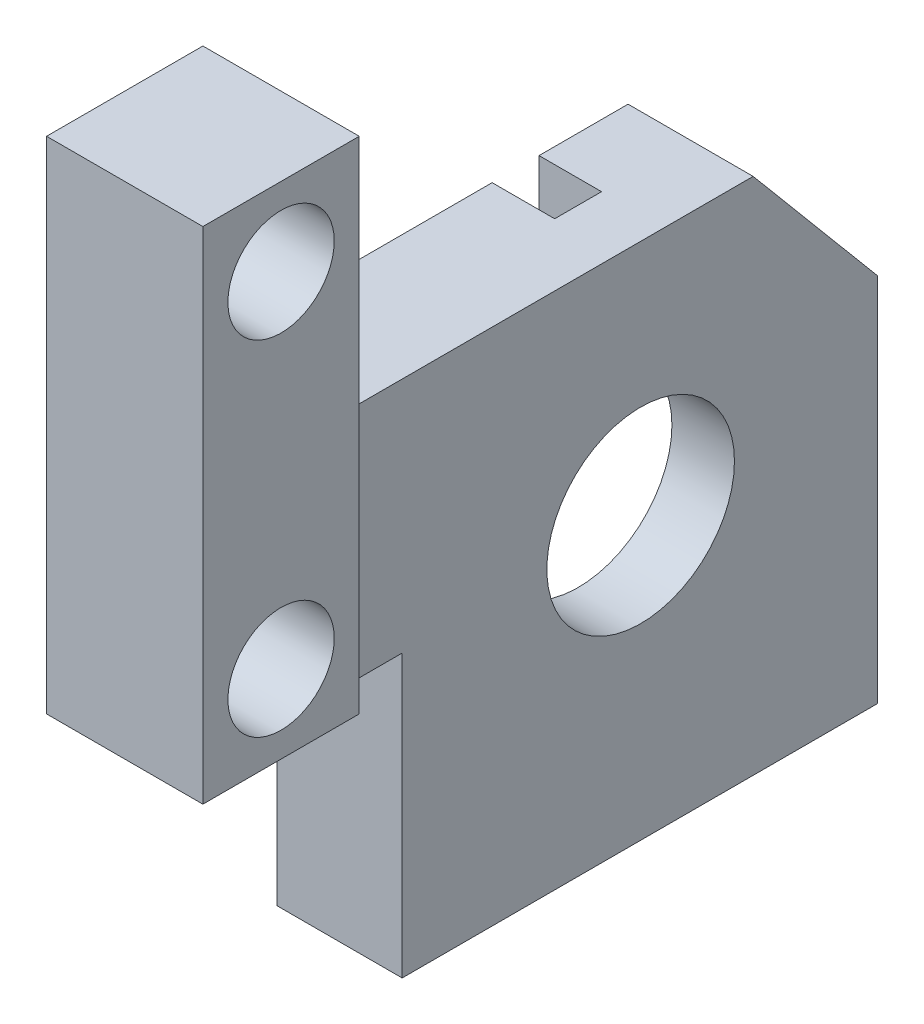
ISO-10303-21;
HEADER;
FILE_DESCRIPTION(('STEP AP214'),'2;1');
FILE_NAME('part.step','',(''),(''),'','','');
FILE_SCHEMA(('AUTOMOTIVE_DESIGN { 1 0 10303 214 1 1 1 1 }'));
ENDSEC;
DATA;
#1=APPLICATION_CONTEXT('core data for automotive mechanical design processes');
#2=APPLICATION_PROTOCOL_DEFINITION('international standard','automotive_design',2000,#1);
#3=PRODUCT_CONTEXT('',#1,'mechanical');
#4=PRODUCT('Part','Part','',(#3));
#5=PRODUCT_RELATED_PRODUCT_CATEGORY('part','',(#4));
#6=PRODUCT_DEFINITION_FORMATION('','',#4);
#7=PRODUCT_DEFINITION_CONTEXT('part definition',#1,'design');
#8=PRODUCT_DEFINITION('design','',#6,#7);
#9=PRODUCT_DEFINITION_SHAPE('','',#8);
#10=(LENGTH_UNIT() NAMED_UNIT(*) SI_UNIT(.MILLI.,.METRE.));
#11=(NAMED_UNIT(*) PLANE_ANGLE_UNIT() SI_UNIT($,.RADIAN.));
#12=(NAMED_UNIT(*) SI_UNIT($,.STERADIAN.) SOLID_ANGLE_UNIT());
#13=UNCERTAINTY_MEASURE_WITH_UNIT(LENGTH_MEASURE(1.E-05),#10,'distance_accuracy_value','');
#14=(GEOMETRIC_REPRESENTATION_CONTEXT(3) GLOBAL_UNCERTAINTY_ASSIGNED_CONTEXT((#13)) GLOBAL_UNIT_ASSIGNED_CONTEXT((#10,
#11,#12)) REPRESENTATION_CONTEXT('',''));
#15=CARTESIAN_POINT('',(0.,0.,0.));
#16=DIRECTION('',(0.,0.,1.));
#17=DIRECTION('',(1.,0.,0.));
#18=AXIS2_PLACEMENT_3D('',#15,#16,#17);
#19=CARTESIAN_POINT('',(20.,0.,0.));
#20=DIRECTION('',(1.,0.,0.));
#21=DIRECTION('',(0.,0.,1.));
#22=AXIS2_PLACEMENT_3D('',#19,#20,#21);
#23=PLANE('',#22);
#24=CARTESIAN_POINT('',(20.,1.90865976235804,0.482116569244563));
#25=DIRECTION('',(1.,0.,0.));
#26=DIRECTION('',(0.,0.,-1.));
#27=AXIS2_PLACEMENT_3D('',#24,#25,#26);
#28=CIRCLE('',#27,3.);
#29=CARTESIAN_POINT('',(20.,1.90865976235804,-2.51788343075544));
#30=VERTEX_POINT('',#29);
#31=EDGE_CURVE('E232',#30,#30,#28,.T.);
#32=ORIENTED_EDGE('',*,*,#31,.T.);
#33=EDGE_LOOP('',(#32));
#34=FACE_BOUND('',#33,.T.);
#35=DIRECTION('',(0.,1.,0.));
#36=VECTOR('',#35,1.);
#37=CARTESIAN_POINT('',(20.,7.49865976235804,1.23211656924456));
#38=LINE('',#37,#36);
#39=CARTESIAN_POINT('',(20.,7.49865976235804,1.23211656924456));
#40=VERTEX_POINT('',#39);
#41=CARTESIAN_POINT('',(20.,9.49865976235804,1.23211656924456));
#42=VERTEX_POINT('',#41);
#43=EDGE_CURVE('E307',#40,#42,#38,.T.);
#44=ORIENTED_EDGE('',*,*,#43,.T.);
#45=DIRECTION('',(0.,0.,1.));
#46=VECTOR('',#45,1.);
#47=CARTESIAN_POINT('',(20.,9.49865976235804,4.07990212889255));
#48=LINE('',#47,#46);
#49=CARTESIAN_POINT('',(20.,9.49865976235804,-0.267883430755437));
#50=VERTEX_POINT('',#49);
#51=EDGE_CURVE('E419',#50,#42,#48,.T.);
#52=ORIENTED_EDGE('',*,*,#51,.F.);
#53=DIRECTION('',(0.,-1.,0.));
#54=VECTOR('',#53,1.);
#55=CARTESIAN_POINT('',(20.,7.49865976235804,-0.267883430755437));
#56=LINE('',#55,#54);
#57=CARTESIAN_POINT('',(20.,7.49865976235804,-0.267883430755437));
#58=VERTEX_POINT('',#57);
#59=EDGE_CURVE('E339',#50,#58,#56,.T.);
#60=ORIENTED_EDGE('',*,*,#59,.T.);
#61=DIRECTION('',(0.,0.,-1.));
#62=VECTOR('',#61,1.);
#63=CARTESIAN_POINT('',(20.,7.49865976235804,-0.267883430755437));
#64=LINE('',#63,#62);
#65=CARTESIAN_POINT('',(20.,7.49865976235804,-2.18305367409341));
#66=VERTEX_POINT('',#65);
#67=EDGE_CURVE('E333',#58,#66,#64,.T.);
#68=ORIENTED_EDGE('',*,*,#67,.T.);
#69=DIRECTION('',(0.,-0.766044443118981,-0.642787609686535));
#70=VECTOR('',#69,1.);
#71=CARTESIAN_POINT('',(20.,4.03347195004924,-5.0906914893617));
#72=LINE('',#71,#70);
#73=CARTESIAN_POINT('',(20.,4.03347195004924,-5.0906914893617));
#74=VERTEX_POINT('',#73);
#75=EDGE_CURVE('E375',#66,#74,#72,.T.);
#76=ORIENTED_EDGE('',*,*,#75,.T.);
#77=DIRECTION('',(0.,-1.,0.));
#78=VECTOR('',#77,1.);
#79=CARTESIAN_POINT('',(20.,4.03347195004924,-5.0906914893617));
#80=LINE('',#79,#78);
#81=CARTESIAN_POINT('',(20.,-5.09134023764196,-5.0906914893617));
#82=VERTEX_POINT('',#81);
#83=EDGE_CURVE('E379',#74,#82,#80,.T.);
#84=ORIENTED_EDGE('',*,*,#83,.T.);
#85=DIRECTION('',(0.,0.,1.));
#86=VECTOR('',#85,1.);
#87=CARTESIAN_POINT('',(20.,-5.09134023764196,-3.01788343075544));
#88=LINE('',#87,#86);
#89=CARTESIAN_POINT('',(20.,-5.09134023764196,-3.01788343075544));
#90=VERTEX_POINT('',#89);
#91=EDGE_CURVE('E383',#82,#90,#88,.T.);
#92=ORIENTED_EDGE('',*,*,#91,.T.);
#93=DIRECTION('',(0.,-1.,0.));
#94=VECTOR('',#93,1.);
#95=CARTESIAN_POINT('',(20.,-5.09134023764196,-3.01788343075544));
#96=LINE('',#95,#94);
#97=CARTESIAN_POINT('',(20.,-7.09134023764196,-3.01788343075544));
#98=VERTEX_POINT('',#97);
#99=EDGE_CURVE('E387',#90,#98,#96,.T.);
#100=ORIENTED_EDGE('',*,*,#99,.T.);
#101=DIRECTION('',(0.,0.,-1.));
#102=VECTOR('',#101,1.);
#103=CARTESIAN_POINT('',(20.,-7.09134023764196,-7.0906914893617));
#104=LINE('',#103,#102);
#105=CARTESIAN_POINT('',(20.,-7.09134023764196,3.98211656924456));
#106=VERTEX_POINT('',#105);
#107=EDGE_CURVE('E414',#106,#98,#104,.T.);
#108=ORIENTED_EDGE('',*,*,#107,.F.);
#109=DIRECTION('',(0.,1.,0.));
#110=VECTOR('',#109,1.);
#111=CARTESIAN_POINT('',(20.,-5.09134023764196,3.98211656924456));
#112=LINE('',#111,#110);
#113=CARTESIAN_POINT('',(20.,-5.09134023764196,3.98211656924456));
#114=VERTEX_POINT('',#113);
#115=EDGE_CURVE('E264',#106,#114,#112,.T.);
#116=ORIENTED_EDGE('',*,*,#115,.T.);
#117=DIRECTION('',(0.,0.,1.));
#118=VECTOR('',#117,1.);
#119=CARTESIAN_POINT('',(20.,-5.09134023764196,6.1093085106383));
#120=LINE('',#119,#118);
#121=CARTESIAN_POINT('',(20.,-5.09134023764196,6.1093085106383));
#122=VERTEX_POINT('',#121);
#123=EDGE_CURVE('E257',#114,#122,#120,.T.);
#124=ORIENTED_EDGE('',*,*,#123,.T.);
#125=DIRECTION('',(0.,1.,0.));
#126=VECTOR('',#125,1.);
#127=CARTESIAN_POINT('',(20.,3.96865976235804,6.1093085106383));
#128=LINE('',#127,#126);
#129=CARTESIAN_POINT('',(20.,3.96865976235804,6.1093085106383));
#130=VERTEX_POINT('',#129);
#131=EDGE_CURVE('E296',#122,#130,#128,.T.);
#132=ORIENTED_EDGE('',*,*,#131,.T.);
#133=DIRECTION('',(0.,0.766044443118982,-0.642787609686534));
#134=VECTOR('',#133,1.);
#135=CARTESIAN_POINT('',(20.,3.96865976235804,6.1093085106383));
#136=LINE('',#135,#134);
#137=CARTESIAN_POINT('',(20.,7.49865976235804,3.14728681258254));
#138=VERTEX_POINT('',#137);
#139=EDGE_CURVE('E300',#130,#138,#136,.T.);
#140=ORIENTED_EDGE('',*,*,#139,.T.);
#141=DIRECTION('',(0.,0.,-1.));
#142=VECTOR('',#141,1.);
#143=CARTESIAN_POINT('',(20.,7.49865976235804,3.14728681258254));
#144=LINE('',#143,#142);
#145=EDGE_CURVE('E304',#138,#40,#144,.T.);
#146=ORIENTED_EDGE('',*,*,#145,.T.);
#147=EDGE_LOOP('',(#44,#52,#60,#68,#76,#84,#92,#100,#108,#116,#124,#132,#140,#146));
#148=FACE_BOUND('',#147,.T.);
#149=ADVANCED_FACE('F39',(#34,#148),#23,.F.);
#150=CARTESIAN_POINT('',(22.,-7.09134023764196,-7.0906914893617));
#151=DIRECTION('',(0.,-1.,0.));
#152=DIRECTION('',(0.,0.,-1.));
#153=AXIS2_PLACEMENT_3D('',#150,#151,#152);
#154=PLANE('',#153);
#155=ORIENTED_EDGE('',*,*,#107,.T.);
#156=DIRECTION('',(1.,0.,0.));
#157=VECTOR('',#156,1.);
#158=CARTESIAN_POINT('',(18.,-7.09134023764196,-3.01788343075544));
#159=LINE('',#158,#157);
#160=CARTESIAN_POINT('',(18.,-7.09134023764196,-3.01788343075544));
#161=VERTEX_POINT('',#160);
#162=EDGE_CURVE('E399',#161,#98,#159,.T.);
#163=ORIENTED_EDGE('',*,*,#162,.F.);
#164=DIRECTION('',(0.,0.,-1.));
#165=VECTOR('',#164,1.);
#166=CARTESIAN_POINT('',(18.,-7.09134023764196,-3.01788343075544));
#167=LINE('',#166,#165);
#168=CARTESIAN_POINT('',(18.,-7.09134023764196,-7.0906914893617));
#169=VERTEX_POINT('',#168);
#170=EDGE_CURVE('E354',#161,#169,#167,.T.);
#171=ORIENTED_EDGE('',*,*,#170,.T.);
#172=DIRECTION('',(-1.,0.,0.));
#173=VECTOR('',#172,1.);
#174=CARTESIAN_POINT('',(22.,-7.09134023764196,-7.0906914893617));
#175=LINE('',#174,#173);
#176=CARTESIAN_POINT('',(22.,-7.09134023764196,-7.0906914893617));
#177=VERTEX_POINT('',#176);
#178=EDGE_CURVE('E43',#177,#169,#175,.T.);
#179=ORIENTED_EDGE('',*,*,#178,.F.);
#180=DIRECTION('',(0.,0.,-1.));
#181=VECTOR('',#180,1.);
#182=CARTESIAN_POINT('',(22.,-7.09134023764196,-7.0906914893617));
#183=LINE('',#182,#181);
#184=CARTESIAN_POINT('',(22.,-7.09134023764196,8.1093085106383));
#185=VERTEX_POINT('',#184);
#186=EDGE_CURVE('E415',#185,#177,#183,.T.);
#187=ORIENTED_EDGE('',*,*,#186,.F.);
#188=DIRECTION('',(-1.,0.,0.));
#189=VECTOR('',#188,1.);
#190=CARTESIAN_POINT('',(22.,-7.09134023764196,8.1093085106383));
#191=LINE('',#190,#189);
#192=CARTESIAN_POINT('',(18.,-7.09134023764196,8.1093085106383));
#193=VERTEX_POINT('',#192);
#194=EDGE_CURVE('E11',#185,#193,#191,.T.);
#195=ORIENTED_EDGE('',*,*,#194,.T.);
#196=DIRECTION('',(0.,0.,-1.));
#197=VECTOR('',#196,1.);
#198=CARTESIAN_POINT('',(18.,-7.09134023764196,8.1093085106383));
#199=LINE('',#198,#197);
#200=CARTESIAN_POINT('',(18.,-7.09134023764196,3.98211656924456));
#201=VERTEX_POINT('',#200);
#202=EDGE_CURVE('E285',#193,#201,#199,.T.);
#203=ORIENTED_EDGE('',*,*,#202,.T.);
#204=DIRECTION('',(1.,0.,0.));
#205=VECTOR('',#204,1.);
#206=CARTESIAN_POINT('',(18.,-7.09134023764196,3.98211656924456));
#207=LINE('',#206,#205);
#208=EDGE_CURVE('E316',#201,#106,#207,.T.);
#209=ORIENTED_EDGE('',*,*,#208,.T.);
#210=EDGE_LOOP('',(#155,#163,#171,#179,#187,#195,#203,#209));
#211=FACE_BOUND('',#210,.T.);
#212=ADVANCED_FACE('F41',(#211),#154,.T.);
#213=CARTESIAN_POINT('',(22.,-7.09134023764196,8.1093085106383));
#214=DIRECTION('',(0.,0.,1.));
#215=DIRECTION('',(0.,-1.,0.));
#216=AXIS2_PLACEMENT_3D('',#213,#214,#215);
#217=PLANE('',#216);
#218=DIRECTION('',(-1.,0.,0.));
#219=VECTOR('',#218,1.);
#220=CARTESIAN_POINT('',(23.,1.90865976235804,8.1093085106383));
#221=LINE('',#220,#219);
#222=CARTESIAN_POINT('',(22.,1.90865976235804,8.1093085106383));
#223=VERTEX_POINT('',#222);
#224=CARTESIAN_POINT('',(18.,1.90865976235804,8.1093085106383));
#225=VERTEX_POINT('',#224);
#226=EDGE_CURVE('E222',#223,#225,#221,.T.);
#227=ORIENTED_EDGE('',*,*,#226,.T.);
#228=DIRECTION('',(0.,-1.,0.));
#229=VECTOR('',#228,1.);
#230=CARTESIAN_POINT('',(18.,4.69660023089044,8.1093085106383));
#231=LINE('',#230,#229);
#232=EDGE_CURVE('E282',#225,#193,#231,.T.);
#233=ORIENTED_EDGE('',*,*,#232,.T.);
#234=ORIENTED_EDGE('',*,*,#194,.F.);
#235=DIRECTION('',(0.,-1.,0.));
#236=VECTOR('',#235,1.);
#237=CARTESIAN_POINT('',(22.,-7.09134023764196,8.1093085106383));
#238=LINE('',#237,#236);
#239=EDGE_CURVE('E210',#223,#185,#238,.T.);
#240=ORIENTED_EDGE('',*,*,#239,.F.);
#241=EDGE_LOOP('',(#227,#233,#234,#240));
#242=FACE_BOUND('',#241,.T.);
#243=ADVANCED_FACE('F221',(#242),#217,.T.);
#244=CARTESIAN_POINT('',(22.,9.49865976235804,4.07990212889255));
#245=DIRECTION('',(0.,1.,0.));
#246=DIRECTION('',(0.,0.,1.));
#247=AXIS2_PLACEMENT_3D('',#244,#245,#246);
#248=PLANE('',#247);
#249=DIRECTION('',(0.,0.,1.));
#250=VECTOR('',#249,1.);
#251=CARTESIAN_POINT('',(22.,9.49865976235804,4.07990212889255));
#252=LINE('',#251,#250);
#253=CARTESIAN_POINT('',(22.,9.49865976235804,-3.11566899040342));
#254=VERTEX_POINT('',#253);
#255=CARTESIAN_POINT('',(22.,9.49865976235804,10.4821165692446));
#256=VERTEX_POINT('',#255);
#257=EDGE_CURVE('E225',#254,#256,#252,.T.);
#258=ORIENTED_EDGE('',*,*,#257,.F.);
#259=DIRECTION('',(-1.,0.,0.));
#260=VECTOR('',#259,1.);
#261=CARTESIAN_POINT('',(22.,9.49865976235804,-3.11566899040342));
#262=LINE('',#261,#260);
#263=CARTESIAN_POINT('',(18.,9.49865976235804,-3.11566899040342));
#264=VERTEX_POINT('',#263);
#265=EDGE_CURVE('E49',#254,#264,#262,.T.);
#266=ORIENTED_EDGE('',*,*,#265,.T.);
#267=DIRECTION('',(0.,0.,1.));
#268=VECTOR('',#267,1.);
#269=CARTESIAN_POINT('',(18.,9.49865976235804,-0.267883430755437));
#270=LINE('',#269,#268);
#271=CARTESIAN_POINT('',(18.,9.49865976235804,-0.267883430755437));
#272=VERTEX_POINT('',#271);
#273=EDGE_CURVE('E364',#264,#272,#270,.T.);
#274=ORIENTED_EDGE('',*,*,#273,.T.);
#275=DIRECTION('',(1.,0.,0.));
#276=VECTOR('',#275,1.);
#277=CARTESIAN_POINT('',(18.,9.49865976235804,-0.267883430755437));
#278=LINE('',#277,#276);
#279=EDGE_CURVE('E396',#272,#50,#278,.T.);
#280=ORIENTED_EDGE('',*,*,#279,.T.);
#281=ORIENTED_EDGE('',*,*,#51,.T.);
#282=DIRECTION('',(1.,0.,0.));
#283=VECTOR('',#282,1.);
#284=CARTESIAN_POINT('',(18.,9.49865976235804,1.23211656924456));
#285=LINE('',#284,#283);
#286=CARTESIAN_POINT('',(18.,9.49865976235804,1.23211656924456));
#287=VERTEX_POINT('',#286);
#288=EDGE_CURVE('E319',#287,#42,#285,.T.);
#289=ORIENTED_EDGE('',*,*,#288,.F.);
#290=DIRECTION('',(0.,0.,1.));
#291=VECTOR('',#290,1.);
#292=CARTESIAN_POINT('',(18.,9.49865976235804,4.07990212889255));
#293=LINE('',#292,#291);
#294=CARTESIAN_POINT('',(18.,9.49865976235804,10.4821165692446));
#295=VERTEX_POINT('',#294);
#296=EDGE_CURVE('E278',#287,#295,#293,.T.);
#297=ORIENTED_EDGE('',*,*,#296,.T.);
#298=DIRECTION('',(-1.,0.,0.));
#299=VECTOR('',#298,1.);
#300=CARTESIAN_POINT('',(23.,9.49865976235804,10.4821165692446));
#301=LINE('',#300,#299);
#302=EDGE_CURVE('E250',#256,#295,#301,.T.);
#303=ORIENTED_EDGE('',*,*,#302,.F.);
#304=EDGE_LOOP('',(#258,#266,#274,#280,#281,#289,#297,#303));
#305=FACE_BOUND('',#304,.T.);
#306=ADVANCED_FACE('F460',(#305),#248,.T.);
#307=CARTESIAN_POINT('',(22.,9.49865976235804,-3.11566899040342));
#308=DIRECTION('',(0.,0.642787609686535,-0.766044443118981));
#309=DIRECTION('',(0.,0.766044443118982,0.642787609686535));
#310=AXIS2_PLACEMENT_3D('',#307,#308,#309);
#311=PLANE('',#310);
#312=ORIENTED_EDGE('',*,*,#265,.F.);
#313=DIRECTION('',(0.,0.766044443118982,0.642787609686535));
#314=VECTOR('',#313,1.);
#315=CARTESIAN_POINT('',(22.,9.49865976235804,-3.11566899040342));
#316=LINE('',#315,#314);
#317=CARTESIAN_POINT('',(22.,4.76141241858164,-7.0906914893617));
#318=VERTEX_POINT('',#317);
#319=EDGE_CURVE('E422',#318,#254,#316,.T.);
#320=ORIENTED_EDGE('',*,*,#319,.F.);
#321=DIRECTION('',(-1.,0.,0.));
#322=VECTOR('',#321,1.);
#323=CARTESIAN_POINT('',(22.,4.76141241858164,-7.0906914893617));
#324=LINE('',#323,#322);
#325=CARTESIAN_POINT('',(18.,4.76141241858164,-7.0906914893617));
#326=VERTEX_POINT('',#325);
#327=EDGE_CURVE('E435',#318,#326,#324,.T.);
#328=ORIENTED_EDGE('',*,*,#327,.T.);
#329=DIRECTION('',(0.,0.766044443118982,0.642787609686535));
#330=VECTOR('',#329,1.);
#331=CARTESIAN_POINT('',(18.,9.49865976235804,-3.11566899040342));
#332=LINE('',#331,#330);
#333=EDGE_CURVE('E361',#326,#264,#332,.T.);
#334=ORIENTED_EDGE('',*,*,#333,.T.);
#335=EDGE_LOOP('',(#312,#320,#328,#334));
#336=FACE_BOUND('',#335,.T.);
#337=ADVANCED_FACE('F456',(#336),#311,.T.);
#338=CARTESIAN_POINT('',(22.,4.76141241858164,-7.0906914893617));
#339=DIRECTION('',(0.,0.,-1.));
#340=DIRECTION('',(0.,1.,0.));
#341=AXIS2_PLACEMENT_3D('',#338,#339,#340);
#342=PLANE('',#341);
#343=ORIENTED_EDGE('',*,*,#327,.F.);
#344=DIRECTION('',(0.,1.,0.));
#345=VECTOR('',#344,1.);
#346=CARTESIAN_POINT('',(22.,4.76141241858164,-7.0906914893617));
#347=LINE('',#346,#345);
#348=EDGE_CURVE('E418',#177,#318,#347,.T.);
#349=ORIENTED_EDGE('',*,*,#348,.F.);
#350=ORIENTED_EDGE('',*,*,#178,.T.);
#351=DIRECTION('',(0.,1.,0.));
#352=VECTOR('',#351,1.);
#353=CARTESIAN_POINT('',(18.,4.76141241858164,-7.0906914893617));
#354=LINE('',#353,#352);
#355=EDGE_CURVE('E358',#169,#326,#354,.T.);
#356=ORIENTED_EDGE('',*,*,#355,.T.);
#357=EDGE_LOOP('',(#343,#349,#350,#356));
#358=FACE_BOUND('',#357,.T.);
#359=ADVANCED_FACE('F445',(#358),#342,.T.);
#360=CARTESIAN_POINT('',(22.,0.,0.));
#361=DIRECTION('',(1.,0.,0.));
#362=DIRECTION('',(0.,0.,1.));
#363=AXIS2_PLACEMENT_3D('',#360,#361,#362);
#364=PLANE('',#363);
#365=ORIENTED_EDGE('',*,*,#239,.T.);
#366=ORIENTED_EDGE('',*,*,#186,.T.);
#367=ORIENTED_EDGE('',*,*,#348,.T.);
#368=ORIENTED_EDGE('',*,*,#319,.T.);
#369=ORIENTED_EDGE('',*,*,#257,.T.);
#370=DIRECTION('',(0.,1.,0.));
#371=VECTOR('',#370,1.);
#372=CARTESIAN_POINT('',(22.,9.49865976235804,10.4821165692446));
#373=LINE('',#372,#371);
#374=CARTESIAN_POINT('',(22.,1.90865976235804,10.4821165692446));
#375=VERTEX_POINT('',#374);
#376=EDGE_CURVE('E213',#375,#256,#373,.T.);
#377=ORIENTED_EDGE('',*,*,#376,.F.);
#378=DIRECTION('',(0.,0.,1.));
#379=VECTOR('',#378,1.);
#380=CARTESIAN_POINT('',(22.,1.90865976235804,10.4821165692446));
#381=LINE('',#380,#379);
#382=EDGE_CURVE('E205',#223,#375,#381,.T.);
#383=ORIENTED_EDGE('',*,*,#382,.F.);
#384=EDGE_LOOP('',(#365,#366,#367,#368,#369,#377,#383));
#385=FACE_BOUND('',#384,.T.);
#386=CARTESIAN_POINT('',(22.,1.90865976235804,0.482116569244563));
#387=DIRECTION('',(1.,0.,0.));
#388=DIRECTION('',(0.,0.,-1.));
#389=AXIS2_PLACEMENT_3D('',#386,#387,#388);
#390=CIRCLE('',#389,3.);
#391=CARTESIAN_POINT('',(22.,1.90865976235804,-2.51788343075544));
#392=VERTEX_POINT('',#391);
#393=EDGE_CURVE('E238',#392,#392,#390,.T.);
#394=ORIENTED_EDGE('',*,*,#393,.F.);
#395=EDGE_LOOP('',(#394));
#396=FACE_BOUND('',#395,.T.);
#397=ADVANCED_FACE('F207',(#385,#396),#364,.T.);
#398=CARTESIAN_POINT('',(18.,7.49865976235804,-0.267883430755437));
#399=DIRECTION('',(0.,1.,0.));
#400=DIRECTION('',(0.,0.,1.));
#401=AXIS2_PLACEMENT_3D('',#398,#399,#400);
#402=PLANE('',#401);
#403=ORIENTED_EDGE('',*,*,#67,.F.);
#404=DIRECTION('',(1.,0.,0.));
#405=VECTOR('',#404,1.);
#406=CARTESIAN_POINT('',(18.,7.49865976235804,-0.267883430755437));
#407=LINE('',#406,#405);
#408=CARTESIAN_POINT('',(18.,7.49865976235804,-0.267883430755437));
#409=VERTEX_POINT('',#408);
#410=EDGE_CURVE('E371',#409,#58,#407,.T.);
#411=ORIENTED_EDGE('',*,*,#410,.F.);
#412=DIRECTION('',(0.,0.,-1.));
#413=VECTOR('',#412,1.);
#414=CARTESIAN_POINT('',(18.,7.49865976235804,-0.267883430755437));
#415=LINE('',#414,#413);
#416=CARTESIAN_POINT('',(18.,7.49865976235804,-2.18305367409341));
#417=VERTEX_POINT('',#416);
#418=EDGE_CURVE('E334',#409,#417,#415,.T.);
#419=ORIENTED_EDGE('',*,*,#418,.T.);
#420=DIRECTION('',(1.,0.,0.));
#421=VECTOR('',#420,1.);
#422=CARTESIAN_POINT('',(18.,7.49865976235804,-2.18305367409341));
#423=LINE('',#422,#421);
#424=EDGE_CURVE('E411',#417,#66,#423,.T.);
#425=ORIENTED_EDGE('',*,*,#424,.T.);
#426=EDGE_LOOP('',(#403,#411,#419,#425));
#427=FACE_BOUND('',#426,.T.);
#428=ADVANCED_FACE('F492',(#427),#402,.F.);
#429=CARTESIAN_POINT('',(18.,4.03347195004924,-5.0906914893617));
#430=DIRECTION('',(0.,0.642787609686535,-0.766044443118982));
#431=DIRECTION('',(0.,0.766044443118982,0.642787609686535));
#432=AXIS2_PLACEMENT_3D('',#429,#430,#431);
#433=PLANE('',#432);
#434=ORIENTED_EDGE('',*,*,#75,.F.);
#435=ORIENTED_EDGE('',*,*,#424,.F.);
#436=DIRECTION('',(0.,-0.766044443118981,-0.642787609686535));
#437=VECTOR('',#436,1.);
#438=CARTESIAN_POINT('',(18.,4.03347195004924,-5.0906914893617));
#439=LINE('',#438,#437);
#440=CARTESIAN_POINT('',(18.,4.03347195004924,-5.0906914893617));
#441=VERTEX_POINT('',#440);
#442=EDGE_CURVE('E338',#417,#441,#439,.T.);
#443=ORIENTED_EDGE('',*,*,#442,.T.);
#444=DIRECTION('',(1.,0.,0.));
#445=VECTOR('',#444,1.);
#446=CARTESIAN_POINT('',(18.,4.03347195004924,-5.0906914893617));
#447=LINE('',#446,#445);
#448=EDGE_CURVE('E408',#441,#74,#447,.T.);
#449=ORIENTED_EDGE('',*,*,#448,.T.);
#450=EDGE_LOOP('',(#434,#435,#443,#449));
#451=FACE_BOUND('',#450,.T.);
#452=ADVANCED_FACE('F488',(#451),#433,.F.);
#453=CARTESIAN_POINT('',(18.,4.03347195004924,-5.0906914893617));
#454=DIRECTION('',(0.,0.,-1.));
#455=DIRECTION('',(0.,1.,0.));
#456=AXIS2_PLACEMENT_3D('',#453,#454,#455);
#457=PLANE('',#456);
#458=ORIENTED_EDGE('',*,*,#83,.F.);
#459=ORIENTED_EDGE('',*,*,#448,.F.);
#460=DIRECTION('',(0.,-1.,0.));
#461=VECTOR('',#460,1.);
#462=CARTESIAN_POINT('',(18.,4.03347195004924,-5.0906914893617));
#463=LINE('',#462,#461);
#464=CARTESIAN_POINT('',(18.,-5.09134023764196,-5.0906914893617));
#465=VERTEX_POINT('',#464);
#466=EDGE_CURVE('E343',#441,#465,#463,.T.);
#467=ORIENTED_EDGE('',*,*,#466,.T.);
#468=DIRECTION('',(1.,0.,0.));
#469=VECTOR('',#468,1.);
#470=CARTESIAN_POINT('',(18.,-5.09134023764196,-5.0906914893617));
#471=LINE('',#470,#469);
#472=EDGE_CURVE('E405',#465,#82,#471,.T.);
#473=ORIENTED_EDGE('',*,*,#472,.T.);
#474=EDGE_LOOP('',(#458,#459,#467,#473));
#475=FACE_BOUND('',#474,.T.);
#476=ADVANCED_FACE('F485',(#475),#457,.F.);
#477=CARTESIAN_POINT('',(18.,-5.09134023764196,-3.01788343075544));
#478=DIRECTION('',(0.,-1.,0.));
#479=DIRECTION('',(0.,0.,-1.));
#480=AXIS2_PLACEMENT_3D('',#477,#478,#479);
#481=PLANE('',#480);
#482=ORIENTED_EDGE('',*,*,#91,.F.);
#483=ORIENTED_EDGE('',*,*,#472,.F.);
#484=DIRECTION('',(0.,0.,1.));
#485=VECTOR('',#484,1.);
#486=CARTESIAN_POINT('',(18.,-5.09134023764196,-3.01788343075544));
#487=LINE('',#486,#485);
#488=CARTESIAN_POINT('',(18.,-5.09134023764196,-3.01788343075544));
#489=VERTEX_POINT('',#488);
#490=EDGE_CURVE('E347',#465,#489,#487,.T.);
#491=ORIENTED_EDGE('',*,*,#490,.T.);
#492=DIRECTION('',(1.,0.,0.));
#493=VECTOR('',#492,1.);
#494=CARTESIAN_POINT('',(18.,-5.09134023764196,-3.01788343075544));
#495=LINE('',#494,#493);
#496=EDGE_CURVE('E402',#489,#90,#495,.T.);
#497=ORIENTED_EDGE('',*,*,#496,.T.);
#498=EDGE_LOOP('',(#482,#483,#491,#497));
#499=FACE_BOUND('',#498,.T.);
#500=ADVANCED_FACE('F480',(#499),#481,.F.);
#501=CARTESIAN_POINT('',(18.,-5.09134023764196,-3.01788343075544));
#502=DIRECTION('',(0.,0.,-1.));
#503=DIRECTION('',(0.,1.,0.));
#504=AXIS2_PLACEMENT_3D('',#501,#502,#503);
#505=PLANE('',#504);
#506=ORIENTED_EDGE('',*,*,#99,.F.);
#507=ORIENTED_EDGE('',*,*,#496,.F.);
#508=DIRECTION('',(0.,-1.,0.));
#509=VECTOR('',#508,1.);
#510=CARTESIAN_POINT('',(18.,-5.09134023764196,-3.01788343075544));
#511=LINE('',#510,#509);
#512=EDGE_CURVE('E351',#489,#161,#511,.T.);
#513=ORIENTED_EDGE('',*,*,#512,.T.);
#514=ORIENTED_EDGE('',*,*,#162,.T.);
#515=EDGE_LOOP('',(#506,#507,#513,#514));
#516=FACE_BOUND('',#515,.T.);
#517=ADVANCED_FACE('F477',(#516),#505,.F.);
#518=CARTESIAN_POINT('',(18.,7.49865976235804,-0.267883430755437));
#519=DIRECTION('',(0.,0.,-1.));
#520=DIRECTION('',(1.,0.,0.));
#521=AXIS2_PLACEMENT_3D('',#518,#519,#520);
#522=PLANE('',#521);
#523=ORIENTED_EDGE('',*,*,#59,.F.);
#524=ORIENTED_EDGE('',*,*,#279,.F.);
#525=DIRECTION('',(0.,-1.,0.));
#526=VECTOR('',#525,1.);
#527=CARTESIAN_POINT('',(18.,7.49865976235804,-0.267883430755437));
#528=LINE('',#527,#526);
#529=EDGE_CURVE('E368',#272,#409,#528,.T.);
#530=ORIENTED_EDGE('',*,*,#529,.T.);
#531=ORIENTED_EDGE('',*,*,#410,.T.);
#532=EDGE_LOOP('',(#523,#524,#530,#531));
#533=FACE_BOUND('',#532,.T.);
#534=ADVANCED_FACE('F496',(#533),#522,.F.);
#535=CARTESIAN_POINT('',(18.,0.,0.));
#536=DIRECTION('',(1.,0.,0.));
#537=DIRECTION('',(0.,0.,1.));
#538=AXIS2_PLACEMENT_3D('',#535,#536,#537);
#539=PLANE('',#538);
#540=ORIENTED_EDGE('',*,*,#418,.F.);
#541=ORIENTED_EDGE('',*,*,#529,.F.);
#542=ORIENTED_EDGE('',*,*,#273,.F.);
#543=ORIENTED_EDGE('',*,*,#333,.F.);
#544=ORIENTED_EDGE('',*,*,#355,.F.);
#545=ORIENTED_EDGE('',*,*,#170,.F.);
#546=ORIENTED_EDGE('',*,*,#512,.F.);
#547=ORIENTED_EDGE('',*,*,#490,.F.);
#548=ORIENTED_EDGE('',*,*,#466,.F.);
#549=ORIENTED_EDGE('',*,*,#442,.F.);
#550=EDGE_LOOP('',(#540,#541,#542,#543,#544,#545,#546,#547,#548,#549));
#551=FACE_BOUND('',#550,.T.);
#552=ADVANCED_FACE('F452',(#551),#539,.F.);
#553=CARTESIAN_POINT('',(18.,-5.09134023764196,6.1093085106383));
#554=DIRECTION('',(0.,-1.,0.));
#555=DIRECTION('',(0.,0.,-1.));
#556=AXIS2_PLACEMENT_3D('',#553,#554,#555);
#557=PLANE('',#556);
#558=ORIENTED_EDGE('',*,*,#123,.F.);
#559=DIRECTION('',(1.,0.,0.));
#560=VECTOR('',#559,1.);
#561=CARTESIAN_POINT('',(18.,-5.09134023764196,3.98211656924456));
#562=LINE('',#561,#560);
#563=CARTESIAN_POINT('',(18.,-5.09134023764196,3.98211656924456));
#564=VERTEX_POINT('',#563);
#565=EDGE_CURVE('E292',#564,#114,#562,.T.);
#566=ORIENTED_EDGE('',*,*,#565,.F.);
#567=DIRECTION('',(0.,0.,1.));
#568=VECTOR('',#567,1.);
#569=CARTESIAN_POINT('',(18.,-5.09134023764196,6.1093085106383));
#570=LINE('',#569,#568);
#571=CARTESIAN_POINT('',(18.,-5.09134023764196,6.1093085106383));
#572=VERTEX_POINT('',#571);
#573=EDGE_CURVE('E259',#564,#572,#570,.T.);
#574=ORIENTED_EDGE('',*,*,#573,.T.);
#575=DIRECTION('',(1.,0.,0.));
#576=VECTOR('',#575,1.);
#577=CARTESIAN_POINT('',(18.,-5.09134023764196,6.1093085106383));
#578=LINE('',#577,#576);
#579=EDGE_CURVE('E330',#572,#122,#578,.T.);
#580=ORIENTED_EDGE('',*,*,#579,.T.);
#581=EDGE_LOOP('',(#558,#566,#574,#580));
#582=FACE_BOUND('',#581,.T.);
#583=ADVANCED_FACE('F611',(#582),#557,.F.);
#584=CARTESIAN_POINT('',(18.,3.96865976235804,6.1093085106383));
#585=DIRECTION('',(0.,0.,1.));
#586=DIRECTION('',(0.,-1.,0.));
#587=AXIS2_PLACEMENT_3D('',#584,#585,#586);
#588=PLANE('',#587);
#589=ORIENTED_EDGE('',*,*,#131,.F.);
#590=ORIENTED_EDGE('',*,*,#579,.F.);
#591=DIRECTION('',(0.,1.,0.));
#592=VECTOR('',#591,1.);
#593=CARTESIAN_POINT('',(18.,3.96865976235804,6.1093085106383));
#594=LINE('',#593,#592);
#595=CARTESIAN_POINT('',(18.,3.96865976235804,6.1093085106383));
#596=VERTEX_POINT('',#595);
#597=EDGE_CURVE('E263',#572,#596,#594,.T.);
#598=ORIENTED_EDGE('',*,*,#597,.T.);
#599=DIRECTION('',(1.,0.,0.));
#600=VECTOR('',#599,1.);
#601=CARTESIAN_POINT('',(18.,3.96865976235804,6.1093085106383));
#602=LINE('',#601,#600);
#603=EDGE_CURVE('E327',#596,#130,#602,.T.);
#604=ORIENTED_EDGE('',*,*,#603,.T.);
#605=EDGE_LOOP('',(#589,#590,#598,#604));
#606=FACE_BOUND('',#605,.T.);
#607=ADVANCED_FACE('F614',(#606),#588,.F.);
#608=CARTESIAN_POINT('',(18.,3.96865976235804,6.1093085106383));
#609=DIRECTION('',(0.,0.642787609686534,0.766044443118982));
#610=DIRECTION('',(0.,-0.766044443118982,0.642787609686534));
#611=AXIS2_PLACEMENT_3D('',#608,#609,#610);
#612=PLANE('',#611);
#613=ORIENTED_EDGE('',*,*,#139,.F.);
#614=ORIENTED_EDGE('',*,*,#603,.F.);
#615=DIRECTION('',(0.,0.766044443118982,-0.642787609686534));
#616=VECTOR('',#615,1.);
#617=CARTESIAN_POINT('',(18.,3.96865976235804,6.1093085106383));
#618=LINE('',#617,#616);
#619=CARTESIAN_POINT('',(18.,7.49865976235804,3.14728681258254));
#620=VERTEX_POINT('',#619);
#621=EDGE_CURVE('E268',#596,#620,#618,.T.);
#622=ORIENTED_EDGE('',*,*,#621,.T.);
#623=DIRECTION('',(1.,0.,0.));
#624=VECTOR('',#623,1.);
#625=CARTESIAN_POINT('',(18.,7.49865976235804,3.14728681258254));
#626=LINE('',#625,#624);
#627=EDGE_CURVE('E324',#620,#138,#626,.T.);
#628=ORIENTED_EDGE('',*,*,#627,.T.);
#629=EDGE_LOOP('',(#613,#614,#622,#628));
#630=FACE_BOUND('',#629,.T.);
#631=ADVANCED_FACE('F618',(#630),#612,.F.);
#632=CARTESIAN_POINT('',(18.,7.49865976235804,3.14728681258254));
#633=DIRECTION('',(0.,1.,0.));
#634=DIRECTION('',(0.,0.,1.));
#635=AXIS2_PLACEMENT_3D('',#632,#633,#634);
#636=PLANE('',#635);
#637=ORIENTED_EDGE('',*,*,#145,.F.);
#638=ORIENTED_EDGE('',*,*,#627,.F.);
#639=DIRECTION('',(0.,0.,-1.));
#640=VECTOR('',#639,1.);
#641=CARTESIAN_POINT('',(18.,7.49865976235804,3.14728681258254));
#642=LINE('',#641,#640);
#643=CARTESIAN_POINT('',(18.,7.49865976235804,1.23211656924456));
#644=VERTEX_POINT('',#643);
#645=EDGE_CURVE('E272',#620,#644,#642,.T.);
#646=ORIENTED_EDGE('',*,*,#645,.T.);
#647=DIRECTION('',(1.,0.,0.));
#648=VECTOR('',#647,1.);
#649=CARTESIAN_POINT('',(18.,7.49865976235804,1.23211656924456));
#650=LINE('',#649,#648);
#651=EDGE_CURVE('E65',#644,#40,#650,.T.);
#652=ORIENTED_EDGE('',*,*,#651,.T.);
#653=EDGE_LOOP('',(#637,#638,#646,#652));
#654=FACE_BOUND('',#653,.T.);
#655=ADVANCED_FACE('F622',(#654),#636,.F.);
#656=CARTESIAN_POINT('',(18.,7.49865976235804,1.23211656924456));
#657=DIRECTION('',(0.,0.,1.));
#658=DIRECTION('',(-1.,0.,0.));
#659=AXIS2_PLACEMENT_3D('',#656,#657,#658);
#660=PLANE('',#659);
#661=ORIENTED_EDGE('',*,*,#43,.F.);
#662=ORIENTED_EDGE('',*,*,#651,.F.);
#663=DIRECTION('',(0.,1.,0.));
#664=VECTOR('',#663,1.);
#665=CARTESIAN_POINT('',(18.,7.49865976235804,1.23211656924456));
#666=LINE('',#665,#664);
#667=EDGE_CURVE('E275',#644,#287,#666,.T.);
#668=ORIENTED_EDGE('',*,*,#667,.T.);
#669=ORIENTED_EDGE('',*,*,#288,.T.);
#670=EDGE_LOOP('',(#661,#662,#668,#669));
#671=FACE_BOUND('',#670,.T.);
#672=ADVANCED_FACE('F501',(#671),#660,.F.);
#673=CARTESIAN_POINT('',(18.,-5.09134023764196,3.98211656924456));
#674=DIRECTION('',(0.,0.,1.));
#675=DIRECTION('',(-1.,0.,0.));
#676=AXIS2_PLACEMENT_3D('',#673,#674,#675);
#677=PLANE('',#676);
#678=ORIENTED_EDGE('',*,*,#115,.F.);
#679=ORIENTED_EDGE('',*,*,#208,.F.);
#680=DIRECTION('',(0.,1.,0.));
#681=VECTOR('',#680,1.);
#682=CARTESIAN_POINT('',(18.,-5.09134023764196,3.98211656924456));
#683=LINE('',#682,#681);
#684=EDGE_CURVE('E289',#201,#564,#683,.T.);
#685=ORIENTED_EDGE('',*,*,#684,.T.);
#686=ORIENTED_EDGE('',*,*,#565,.T.);
#687=EDGE_LOOP('',(#678,#679,#685,#686));
#688=FACE_BOUND('',#687,.T.);
#689=ADVANCED_FACE('F470',(#688),#677,.F.);
#690=CARTESIAN_POINT('',(18.,0.,0.));
#691=DIRECTION('',(1.,0.,0.));
#692=DIRECTION('',(0.,0.,1.));
#693=AXIS2_PLACEMENT_3D('',#690,#691,#692);
#694=PLANE('',#693);
#695=DIRECTION('',(0.,0.,-1.));
#696=VECTOR('',#695,1.);
#697=CARTESIAN_POINT('',(18.,1.90865976235804,15.4821165692446));
#698=LINE('',#697,#696);
#699=CARTESIAN_POINT('',(18.,1.90865976235804,15.4821165692446));
#700=VERTEX_POINT('',#699);
#701=EDGE_CURVE('E229',#700,#225,#698,.T.);
#702=ORIENTED_EDGE('',*,*,#701,.F.);
#703=DIRECTION('',(0.,-1.,0.));
#704=VECTOR('',#703,1.);
#705=CARTESIAN_POINT('',(18.,17.908659762358,15.4821165692446));
#706=LINE('',#705,#704);
#707=CARTESIAN_POINT('',(18.,17.908659762358,15.4821165692446));
#708=VERTEX_POINT('',#707);
#709=EDGE_CURVE('E545',#708,#700,#706,.T.);
#710=ORIENTED_EDGE('',*,*,#709,.F.);
#711=DIRECTION('',(0.,0.,1.));
#712=VECTOR('',#711,1.);
#713=CARTESIAN_POINT('',(18.,17.908659762358,15.4821165692446));
#714=LINE('',#713,#712);
#715=CARTESIAN_POINT('',(18.,17.908659762358,10.4821165692446));
#716=VERTEX_POINT('',#715);
#717=EDGE_CURVE('E508',#716,#708,#714,.T.);
#718=ORIENTED_EDGE('',*,*,#717,.F.);
#719=DIRECTION('',(0.,1.,0.));
#720=VECTOR('',#719,1.);
#721=CARTESIAN_POINT('',(18.,17.908659762358,10.4821165692446));
#722=LINE('',#721,#720);
#723=EDGE_CURVE('E505',#295,#716,#722,.T.);
#724=ORIENTED_EDGE('',*,*,#723,.F.);
#725=ORIENTED_EDGE('',*,*,#296,.F.);
#726=ORIENTED_EDGE('',*,*,#667,.F.);
#727=ORIENTED_EDGE('',*,*,#645,.F.);
#728=ORIENTED_EDGE('',*,*,#621,.F.);
#729=ORIENTED_EDGE('',*,*,#597,.F.);
#730=ORIENTED_EDGE('',*,*,#573,.F.);
#731=ORIENTED_EDGE('',*,*,#684,.F.);
#732=ORIENTED_EDGE('',*,*,#202,.F.);
#733=ORIENTED_EDGE('',*,*,#232,.F.);
#734=EDGE_LOOP('',(#702,#710,#718,#724,#725,#726,#727,#728,#729,#730,#731,#732,#733));
#735=FACE_BOUND('',#734,.T.);
#736=CARTESIAN_POINT('',(18.,15.408659762358,12.9821165692446));
#737=DIRECTION('',(1.,0.,0.));
#738=DIRECTION('',(0.,0.,-1.));
#739=AXIS2_PLACEMENT_3D('',#736,#737,#738);
#740=CIRCLE('',#739,1.7);
#741=CARTESIAN_POINT('',(18.,15.408659762358,11.2821165692446));
#742=VERTEX_POINT('',#741);
#743=EDGE_CURVE('E517',#742,#742,#740,.T.);
#744=ORIENTED_EDGE('',*,*,#743,.T.);
#745=EDGE_LOOP('',(#744));
#746=FACE_BOUND('',#745,.T.);
#747=CARTESIAN_POINT('',(18.,4.40865976235804,12.9821165692446));
#748=DIRECTION('',(1.,0.,0.));
#749=DIRECTION('',(0.,0.,-1.));
#750=AXIS2_PLACEMENT_3D('',#747,#748,#749);
#751=CIRCLE('',#750,1.7);
#752=CARTESIAN_POINT('',(18.,4.40865976235804,11.2821165692446));
#753=VERTEX_POINT('',#752);
#754=EDGE_CURVE('E524',#753,#753,#751,.T.);
#755=ORIENTED_EDGE('',*,*,#754,.T.);
#756=EDGE_LOOP('',(#755));
#757=FACE_BOUND('',#756,.T.);
#758=ADVANCED_FACE('F465',(#735,#746,#757),#694,.F.);
#759=CARTESIAN_POINT('',(22.,1.90865976235804,0.482116569244563));
#760=DIRECTION('',(-1.,0.,0.));
#761=DIRECTION('',(0.,0.,-1.));
#762=AXIS2_PLACEMENT_3D('',#759,#760,#761);
#763=CYLINDRICAL_SURFACE('',#762,3.);
#764=ORIENTED_EDGE('',*,*,#393,.T.);
#765=EDGE_LOOP('',(#764));
#766=FACE_BOUND('',#765,.T.);
#767=ORIENTED_EDGE('',*,*,#31,.F.);
#768=EDGE_LOOP('',(#767));
#769=FACE_BOUND('',#768,.T.);
#770=ADVANCED_FACE('F632',(#766,#769),#763,.F.);
#771=CARTESIAN_POINT('',(23.,1.90865976235804,15.4821165692446));
#772=DIRECTION('',(0.,-1.,0.));
#773=DIRECTION('',(0.,0.,-1.));
#774=AXIS2_PLACEMENT_3D('',#771,#772,#773);
#775=PLANE('',#774);
#776=DIRECTION('',(1.,0.,0.));
#777=VECTOR('',#776,1.);
#778=CARTESIAN_POINT('',(22.,1.90865976235804,10.4821165692446));
#779=LINE('',#778,#777);
#780=CARTESIAN_POINT('',(23.,1.90865976235804,10.4821165692446));
#781=VERTEX_POINT('',#780);
#782=EDGE_CURVE('E513',#375,#781,#779,.T.);
#783=ORIENTED_EDGE('',*,*,#782,.T.);
#784=DIRECTION('',(0.,0.,-1.));
#785=VECTOR('',#784,1.);
#786=CARTESIAN_POINT('',(23.,1.90865976235804,15.4821165692446));
#787=LINE('',#786,#785);
#788=CARTESIAN_POINT('',(23.,1.90865976235804,15.4821165692446));
#789=VERTEX_POINT('',#788);
#790=EDGE_CURVE('E254',#789,#781,#787,.T.);
#791=ORIENTED_EDGE('',*,*,#790,.F.);
#792=DIRECTION('',(-1.,0.,0.));
#793=VECTOR('',#792,1.);
#794=CARTESIAN_POINT('',(23.,1.90865976235804,15.4821165692446));
#795=LINE('',#794,#793);
#796=EDGE_CURVE('E233',#789,#700,#795,.T.);
#797=ORIENTED_EDGE('',*,*,#796,.T.);
#798=ORIENTED_EDGE('',*,*,#701,.T.);
#799=ORIENTED_EDGE('',*,*,#226,.F.);
#800=ORIENTED_EDGE('',*,*,#382,.T.);
#801=EDGE_LOOP('',(#783,#791,#797,#798,#799,#800));
#802=FACE_BOUND('',#801,.T.);
#803=ADVANCED_FACE('F227',(#802),#775,.T.);
#804=CARTESIAN_POINT('',(23.,17.908659762358,15.4821165692446));
#805=DIRECTION('',(0.,0.,1.));
#806=DIRECTION('',(-1.,0.,0.));
#807=AXIS2_PLACEMENT_3D('',#804,#805,#806);
#808=PLANE('',#807);
#809=ORIENTED_EDGE('',*,*,#709,.T.);
#810=ORIENTED_EDGE('',*,*,#796,.F.);
#811=DIRECTION('',(0.,-1.,0.));
#812=VECTOR('',#811,1.);
#813=CARTESIAN_POINT('',(23.,17.908659762358,15.4821165692446));
#814=LINE('',#813,#812);
#815=CARTESIAN_POINT('',(23.,17.908659762358,15.4821165692446));
#816=VERTEX_POINT('',#815);
#817=EDGE_CURVE('E539',#816,#789,#814,.T.);
#818=ORIENTED_EDGE('',*,*,#817,.F.);
#819=DIRECTION('',(-1.,0.,0.));
#820=VECTOR('',#819,1.);
#821=CARTESIAN_POINT('',(23.,17.908659762358,15.4821165692446));
#822=LINE('',#821,#820);
#823=EDGE_CURVE('E240',#816,#708,#822,.T.);
#824=ORIENTED_EDGE('',*,*,#823,.T.);
#825=EDGE_LOOP('',(#809,#810,#818,#824));
#826=FACE_BOUND('',#825,.T.);
#827=ADVANCED_FACE('F551',(#826),#808,.T.);
#828=CARTESIAN_POINT('',(23.,17.908659762358,15.4821165692446));
#829=DIRECTION('',(0.,1.,0.));
#830=DIRECTION('',(0.,0.,1.));
#831=AXIS2_PLACEMENT_3D('',#828,#829,#830);
#832=PLANE('',#831);
#833=ORIENTED_EDGE('',*,*,#717,.T.);
#834=ORIENTED_EDGE('',*,*,#823,.F.);
#835=DIRECTION('',(0.,0.,1.));
#836=VECTOR('',#835,1.);
#837=CARTESIAN_POINT('',(23.,17.908659762358,15.4821165692446));
#838=LINE('',#837,#836);
#839=CARTESIAN_POINT('',(23.,17.908659762358,10.4821165692446));
#840=VERTEX_POINT('',#839);
#841=EDGE_CURVE('E536',#840,#816,#838,.T.);
#842=ORIENTED_EDGE('',*,*,#841,.F.);
#843=DIRECTION('',(-1.,0.,0.));
#844=VECTOR('',#843,1.);
#845=CARTESIAN_POINT('',(23.,17.908659762358,10.4821165692446));
#846=LINE('',#845,#844);
#847=EDGE_CURVE('E247',#840,#716,#846,.T.);
#848=ORIENTED_EDGE('',*,*,#847,.T.);
#849=EDGE_LOOP('',(#833,#834,#842,#848));
#850=FACE_BOUND('',#849,.T.);
#851=ADVANCED_FACE('F557',(#850),#832,.T.);
#852=CARTESIAN_POINT('',(23.,17.908659762358,10.4821165692446));
#853=DIRECTION('',(0.,0.,-1.));
#854=DIRECTION('',(0.,1.,0.));
#855=AXIS2_PLACEMENT_3D('',#852,#853,#854);
#856=PLANE('',#855);
#857=ORIENTED_EDGE('',*,*,#723,.T.);
#858=ORIENTED_EDGE('',*,*,#847,.F.);
#859=DIRECTION('',(0.,1.,0.));
#860=VECTOR('',#859,1.);
#861=CARTESIAN_POINT('',(23.,17.908659762358,10.4821165692446));
#862=LINE('',#861,#860);
#863=EDGE_CURVE('E57',#781,#840,#862,.T.);
#864=ORIENTED_EDGE('',*,*,#863,.F.);
#865=ORIENTED_EDGE('',*,*,#782,.F.);
#866=ORIENTED_EDGE('',*,*,#376,.T.);
#867=ORIENTED_EDGE('',*,*,#302,.T.);
#868=EDGE_LOOP('',(#857,#858,#864,#865,#866,#867));
#869=FACE_BOUND('',#868,.T.);
#870=ADVANCED_FACE('F512',(#869),#856,.T.);
#871=CARTESIAN_POINT('',(23.,0.,0.));
#872=DIRECTION('',(-1.,0.,0.));
#873=DIRECTION('',(0.,0.,-1.));
#874=AXIS2_PLACEMENT_3D('',#871,#872,#873);
#875=PLANE('',#874);
#876=CARTESIAN_POINT('',(23.,15.408659762358,12.9821165692446));
#877=DIRECTION('',(1.,0.,0.));
#878=DIRECTION('',(0.,0.,-1.));
#879=AXIS2_PLACEMENT_3D('',#876,#877,#878);
#880=CIRCLE('',#879,1.7);
#881=CARTESIAN_POINT('',(23.,15.408659762358,11.2821165692446));
#882=VERTEX_POINT('',#881);
#883=EDGE_CURVE('E520',#882,#882,#880,.T.);
#884=ORIENTED_EDGE('',*,*,#883,.F.);
#885=EDGE_LOOP('',(#884));
#886=FACE_BOUND('',#885,.T.);
#887=CARTESIAN_POINT('',(23.,4.40865976235804,12.9821165692446));
#888=DIRECTION('',(1.,0.,0.));
#889=DIRECTION('',(0.,0.,-1.));
#890=AXIS2_PLACEMENT_3D('',#887,#888,#889);
#891=CIRCLE('',#890,1.7);
#892=CARTESIAN_POINT('',(23.,4.40865976235804,11.2821165692446));
#893=VERTEX_POINT('',#892);
#894=EDGE_CURVE('E510',#893,#893,#891,.T.);
#895=ORIENTED_EDGE('',*,*,#894,.F.);
#896=EDGE_LOOP('',(#895));
#897=FACE_BOUND('',#896,.T.);
#898=ORIENTED_EDGE('',*,*,#863,.T.);
#899=ORIENTED_EDGE('',*,*,#841,.T.);
#900=ORIENTED_EDGE('',*,*,#817,.T.);
#901=ORIENTED_EDGE('',*,*,#790,.T.);
#902=EDGE_LOOP('',(#898,#899,#900,#901));
#903=FACE_BOUND('',#902,.T.);
#904=ADVANCED_FACE('F559',(#886,#897,#903),#875,.F.);
#905=CARTESIAN_POINT('',(23.,4.40865976235804,12.9821165692446));
#906=DIRECTION('',(-1.,0.,0.));
#907=DIRECTION('',(0.,0.,-1.));
#908=AXIS2_PLACEMENT_3D('',#905,#906,#907);
#909=CYLINDRICAL_SURFACE('',#908,1.7);
#910=ORIENTED_EDGE('',*,*,#894,.T.);
#911=EDGE_LOOP('',(#910));
#912=FACE_BOUND('',#911,.T.);
#913=ORIENTED_EDGE('',*,*,#754,.F.);
#914=EDGE_LOOP('',(#913));
#915=FACE_BOUND('',#914,.T.);
#916=ADVANCED_FACE('F561',(#912,#915),#909,.F.);
#917=CARTESIAN_POINT('',(23.,15.408659762358,12.9821165692446));
#918=DIRECTION('',(-1.,0.,0.));
#919=DIRECTION('',(0.,0.,-1.));
#920=AXIS2_PLACEMENT_3D('',#917,#918,#919);
#921=CYLINDRICAL_SURFACE('',#920,1.7);
#922=ORIENTED_EDGE('',*,*,#883,.T.);
#923=EDGE_LOOP('',(#922));
#924=FACE_BOUND('',#923,.T.);
#925=ORIENTED_EDGE('',*,*,#743,.F.);
#926=EDGE_LOOP('',(#925));
#927=FACE_BOUND('',#926,.T.);
#928=ADVANCED_FACE('F568',(#924,#927),#921,.F.);
#929=CLOSED_SHELL('',(#149,#212,#243,#306,#337,#359,#397,#428,#452,#476,#500,#517,#534,#552,
#583,#607,#631,#655,#672,#689,#758,#770,#803,#827,#851,#870,#904,#916,#928));
#930=MANIFOLD_SOLID_BREP('B2',#929);
#931=ADVANCED_BREP_SHAPE_REPRESENTATION('',(#18,#930),#14);
#932=SHAPE_DEFINITION_REPRESENTATION(#9,#931);
ENDSEC;
END-ISO-10303-21;
